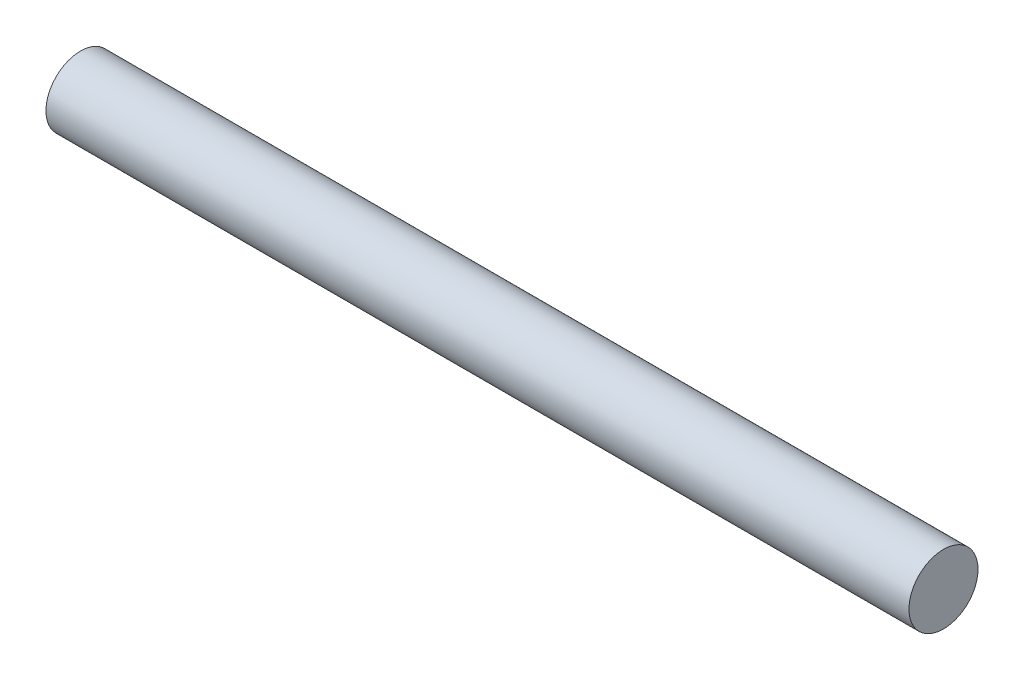
ISO-10303-21;
HEADER;
FILE_DESCRIPTION(('STEP AP214'),'2;1');
FILE_NAME('part.step','',(''),(''),'','','');
FILE_SCHEMA(('AUTOMOTIVE_DESIGN { 1 0 10303 214 1 1 1 1 }'));
ENDSEC;
DATA;
#1=APPLICATION_CONTEXT('core data for automotive mechanical design processes');
#2=APPLICATION_PROTOCOL_DEFINITION('international standard','automotive_design',2000,#1);
#3=PRODUCT_CONTEXT('',#1,'mechanical');
#4=PRODUCT('Part','Part','',(#3));
#5=PRODUCT_RELATED_PRODUCT_CATEGORY('part','',(#4));
#6=PRODUCT_DEFINITION_FORMATION('','',#4);
#7=PRODUCT_DEFINITION_CONTEXT('part definition',#1,'design');
#8=PRODUCT_DEFINITION('design','',#6,#7);
#9=PRODUCT_DEFINITION_SHAPE('','',#8);
#10=(LENGTH_UNIT() NAMED_UNIT(*) SI_UNIT(.MILLI.,.METRE.));
#11=(NAMED_UNIT(*) PLANE_ANGLE_UNIT() SI_UNIT($,.RADIAN.));
#12=(NAMED_UNIT(*) SI_UNIT($,.STERADIAN.) SOLID_ANGLE_UNIT());
#13=UNCERTAINTY_MEASURE_WITH_UNIT(LENGTH_MEASURE(1.E-05),#10,'distance_accuracy_value','');
#14=(GEOMETRIC_REPRESENTATION_CONTEXT(3) GLOBAL_UNCERTAINTY_ASSIGNED_CONTEXT((#13)) GLOBAL_UNIT_ASSIGNED_CONTEXT((#10,
#11,#12)) REPRESENTATION_CONTEXT('',''));
#15=CARTESIAN_POINT('',(0.,0.,0.));
#16=DIRECTION('',(0.,0.,1.));
#17=DIRECTION('',(1.,0.,0.));
#18=AXIS2_PLACEMENT_3D('',#15,#16,#17);
#19=CARTESIAN_POINT('',(100.,0.,0.));
#20=DIRECTION('',(-1.,0.,0.));
#21=DIRECTION('',(0.,0.,1.));
#22=AXIS2_PLACEMENT_3D('',#19,#20,#21);
#23=CYLINDRICAL_SURFACE('',#22,4.);
#24=CARTESIAN_POINT('',(100.,0.,0.));
#25=DIRECTION('',(1.,0.,0.));
#26=DIRECTION('',(0.,0.,-1.));
#27=AXIS2_PLACEMENT_3D('',#24,#25,#26);
#28=CIRCLE('',#27,4.);
#29=CARTESIAN_POINT('',(100.,0.,-4.));
#30=VERTEX_POINT('',#29);
#31=EDGE_CURVE('E10',#30,#30,#28,.T.);
#32=ORIENTED_EDGE('',*,*,#31,.F.);
#33=EDGE_LOOP('',(#32));
#34=FACE_BOUND('',#33,.T.);
#35=CARTESIAN_POINT('',(0.,0.,0.));
#36=DIRECTION('',(1.,0.,0.));
#37=DIRECTION('',(0.,0.,-1.));
#38=AXIS2_PLACEMENT_3D('',#35,#36,#37);
#39=CIRCLE('',#38,4.);
#40=CARTESIAN_POINT('',(0.,0.,-4.));
#41=VERTEX_POINT('',#40);
#42=EDGE_CURVE('E33',#41,#41,#39,.T.);
#43=ORIENTED_EDGE('',*,*,#42,.T.);
#44=EDGE_LOOP('',(#43));
#45=FACE_BOUND('',#44,.T.);
#46=ADVANCED_FACE('F30',(#34,#45),#23,.T.);
#47=CARTESIAN_POINT('',(100.,0.,0.));
#48=DIRECTION('',(1.,0.,0.));
#49=DIRECTION('',(0.,0.,-1.));
#50=AXIS2_PLACEMENT_3D('',#47,#48,#49);
#51=PLANE('',#50);
#52=ORIENTED_EDGE('',*,*,#31,.T.);
#53=EDGE_LOOP('',(#52));
#54=FACE_BOUND('',#53,.T.);
#55=ADVANCED_FACE('F59',(#54),#51,.T.);
#56=CARTESIAN_POINT('',(0.,0.,0.));
#57=DIRECTION('',(1.,0.,0.));
#58=DIRECTION('',(0.,0.,-1.));
#59=AXIS2_PLACEMENT_3D('',#56,#57,#58);
#60=PLANE('',#59);
#61=CARTESIAN_POINT('',(0.,0.,0.));
#62=DIRECTION('',(-1.,0.,0.));
#63=DIRECTION('',(0.,0.,1.));
#64=AXIS2_PLACEMENT_3D('',#61,#62,#63);
#65=CIRCLE('',#64,1.65);
#66=CARTESIAN_POINT('',(0.,0.,1.65));
#67=VERTEX_POINT('',#66);
#68=EDGE_CURVE('E42',#67,#67,#65,.T.);
#69=ORIENTED_EDGE('',*,*,#68,.F.);
#70=EDGE_LOOP('',(#69));
#71=FACE_BOUND('',#70,.T.);
#72=ORIENTED_EDGE('',*,*,#42,.F.);
#73=EDGE_LOOP('',(#72));
#74=FACE_BOUND('',#73,.T.);
#75=ADVANCED_FACE('F53',(#71,#74),#60,.F.);
#76=CARTESIAN_POINT('',(4.,0.,0.));
#77=DIRECTION('',(-1.,0.,0.));
#78=DIRECTION('',(0.,0.,1.));
#79=AXIS2_PLACEMENT_3D('',#76,#77,#78);
#80=CYLINDRICAL_SURFACE('',#79,1.65);
#81=CARTESIAN_POINT('',(4.,0.,0.));
#82=DIRECTION('',(-1.,0.,0.));
#83=DIRECTION('',(0.,0.,1.));
#84=AXIS2_PLACEMENT_3D('',#81,#82,#83);
#85=CIRCLE('',#84,1.65);
#86=CARTESIAN_POINT('',(4.,0.,1.65));
#87=VERTEX_POINT('',#86);
#88=EDGE_CURVE('E40',#87,#87,#85,.T.);
#89=ORIENTED_EDGE('',*,*,#88,.F.);
#90=EDGE_LOOP('',(#89));
#91=FACE_BOUND('',#90,.T.);
#92=ORIENTED_EDGE('',*,*,#68,.T.);
#93=EDGE_LOOP('',(#92));
#94=FACE_BOUND('',#93,.T.);
#95=ADVANCED_FACE('F50',(#91,#94),#80,.F.);
#96=CARTESIAN_POINT('',(4.,0.,0.));
#97=DIRECTION('',(-1.,0.,0.));
#98=DIRECTION('',(0.,0.,1.));
#99=AXIS2_PLACEMENT_3D('',#96,#97,#98);
#100=PLANE('',#99);
#101=ORIENTED_EDGE('',*,*,#88,.T.);
#102=EDGE_LOOP('',(#101));
#103=FACE_BOUND('',#102,.T.);
#104=ADVANCED_FACE('F48',(#103),#100,.T.);
#105=CLOSED_SHELL('',(#46,#55,#75,#95,#104));
#106=MANIFOLD_SOLID_BREP('B2',#105);
#107=ADVANCED_BREP_SHAPE_REPRESENTATION('',(#18,#106),#14);
#108=SHAPE_DEFINITION_REPRESENTATION(#9,#107);
ENDSEC;
END-ISO-10303-21;
